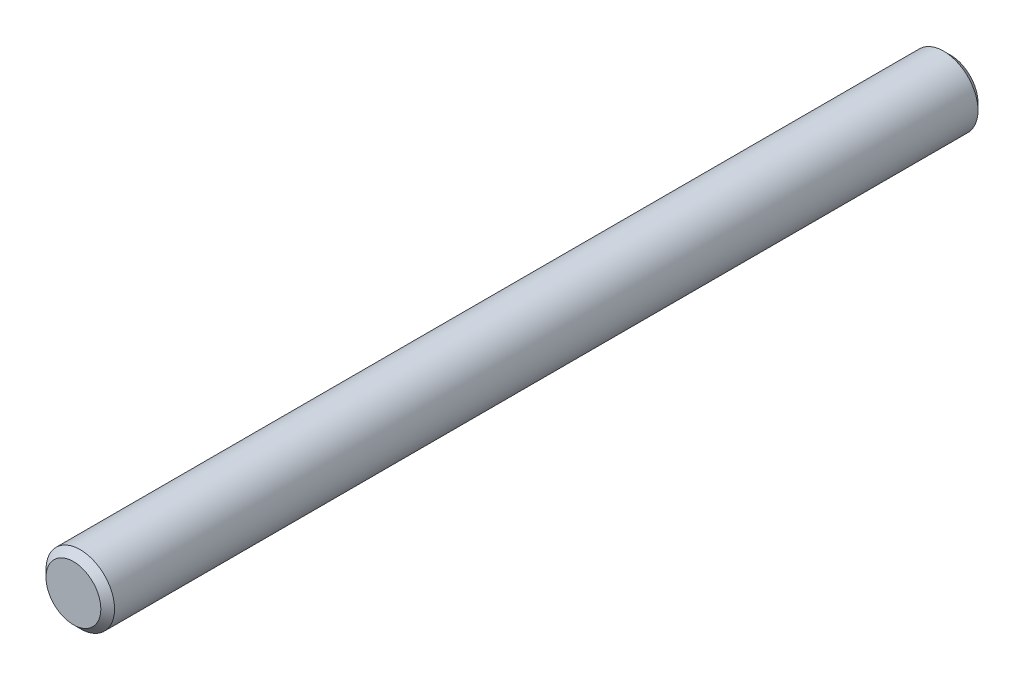
ISO-10303-21;
HEADER;
FILE_DESCRIPTION(('STEP AP214'),'2;1');
FILE_NAME('part.step','',(''),(''),'','','');
FILE_SCHEMA(('AUTOMOTIVE_DESIGN { 1 0 10303 214 1 1 1 1 }'));
ENDSEC;
DATA;
#1=APPLICATION_CONTEXT('core data for automotive mechanical design processes');
#2=APPLICATION_PROTOCOL_DEFINITION('international standard','automotive_design',2000,#1);
#3=PRODUCT_CONTEXT('',#1,'mechanical');
#4=PRODUCT('Part','Part','',(#3));
#5=PRODUCT_RELATED_PRODUCT_CATEGORY('part','',(#4));
#6=PRODUCT_DEFINITION_FORMATION('','',#4);
#7=PRODUCT_DEFINITION_CONTEXT('part definition',#1,'design');
#8=PRODUCT_DEFINITION('design','',#6,#7);
#9=PRODUCT_DEFINITION_SHAPE('','',#8);
#10=(LENGTH_UNIT() NAMED_UNIT(*) SI_UNIT(.MILLI.,.METRE.));
#11=(NAMED_UNIT(*) PLANE_ANGLE_UNIT() SI_UNIT($,.RADIAN.));
#12=(NAMED_UNIT(*) SI_UNIT($,.STERADIAN.) SOLID_ANGLE_UNIT());
#13=UNCERTAINTY_MEASURE_WITH_UNIT(LENGTH_MEASURE(1.E-05),#10,'distance_accuracy_value','');
#14=(GEOMETRIC_REPRESENTATION_CONTEXT(3) GLOBAL_UNCERTAINTY_ASSIGNED_CONTEXT((#13)) GLOBAL_UNIT_ASSIGNED_CONTEXT((#10,
#11,#12)) REPRESENTATION_CONTEXT('',''));
#15=CARTESIAN_POINT('',(0.,0.,0.));
#16=DIRECTION('',(0.,0.,1.));
#17=DIRECTION('',(1.,0.,0.));
#18=AXIS2_PLACEMENT_3D('',#15,#16,#17);
#19=CARTESIAN_POINT('',(0.,0.,101.6));
#20=DIRECTION('',(0.,0.,-1.));
#21=DIRECTION('',(-1.,0.,0.));
#22=AXIS2_PLACEMENT_3D('',#19,#20,#21);
#23=CYLINDRICAL_SURFACE('',#22,7.9375);
#24=CARTESIAN_POINT('',(0.,0.,-100.0125));
#25=DIRECTION('',(0.,0.,1.));
#26=DIRECTION('',(1.,0.,0.));
#27=AXIS2_PLACEMENT_3D('',#24,#25,#26);
#28=CIRCLE('',#27,7.9375);
#29=CARTESIAN_POINT('',(7.9375,0.,-100.0125));
#30=VERTEX_POINT('',#29);
#31=EDGE_CURVE('E50',#30,#30,#28,.T.);
#32=ORIENTED_EDGE('',*,*,#31,.T.);
#33=EDGE_LOOP('',(#32));
#34=FACE_BOUND('',#33,.T.);
#35=CARTESIAN_POINT('',(0.,0.,100.0125));
#36=DIRECTION('',(0.,0.,1.));
#37=DIRECTION('',(1.,0.,0.));
#38=AXIS2_PLACEMENT_3D('',#35,#36,#37);
#39=CIRCLE('',#38,7.9375);
#40=CARTESIAN_POINT('',(7.9375,0.,100.0125));
#41=VERTEX_POINT('',#40);
#42=EDGE_CURVE('E55',#41,#41,#39,.F.);
#43=ORIENTED_EDGE('',*,*,#42,.T.);
#44=EDGE_LOOP('',(#43));
#45=FACE_BOUND('',#44,.T.);
#46=ADVANCED_FACE('F37',(#34,#45),#23,.T.);
#47=CARTESIAN_POINT('',(0.,0.,101.6));
#48=DIRECTION('',(0.,0.,1.));
#49=DIRECTION('',(1.,0.,0.));
#50=AXIS2_PLACEMENT_3D('',#47,#48,#49);
#51=PLANE('',#50);
#52=CARTESIAN_POINT('',(0.,0.,101.6));
#53=DIRECTION('',(0.,0.,1.));
#54=DIRECTION('',(1.,0.,0.));
#55=AXIS2_PLACEMENT_3D('',#52,#53,#54);
#56=CIRCLE('',#55,6.34999999999997);
#57=CARTESIAN_POINT('',(6.34999999999997,0.,101.6));
#58=VERTEX_POINT('',#57);
#59=EDGE_CURVE('E10',#58,#58,#56,.T.);
#60=ORIENTED_EDGE('',*,*,#59,.T.);
#61=EDGE_LOOP('',(#60));
#62=FACE_BOUND('',#61,.T.);
#63=ADVANCED_FACE('F72',(#62),#51,.T.);
#64=CARTESIAN_POINT('',(0.,0.,-101.6));
#65=DIRECTION('',(0.,0.,1.));
#66=DIRECTION('',(1.,0.,0.));
#67=AXIS2_PLACEMENT_3D('',#64,#65,#66);
#68=PLANE('',#67);
#69=CARTESIAN_POINT('',(0.,0.,-101.6));
#70=DIRECTION('',(0.,0.,1.));
#71=DIRECTION('',(1.,0.,0.));
#72=AXIS2_PLACEMENT_3D('',#69,#70,#71);
#73=CIRCLE('',#72,6.35000000000002);
#74=CARTESIAN_POINT('',(6.35000000000002,0.,-101.6));
#75=VERTEX_POINT('',#74);
#76=EDGE_CURVE('E45',#75,#75,#73,.F.);
#77=ORIENTED_EDGE('',*,*,#76,.T.);
#78=EDGE_LOOP('',(#77));
#79=FACE_BOUND('',#78,.T.);
#80=ADVANCED_FACE('F69',(#79),#68,.F.);
#81=CARTESIAN_POINT('',(0.,0.,-100.0125));
#82=DIRECTION('',(0.,0.,1.));
#83=DIRECTION('',(1.,0.,0.));
#84=AXIS2_PLACEMENT_3D('',#81,#82,#83);
#85=CONICAL_SURFACE('',#84,7.9375,0.785398163397435);
#86=ORIENTED_EDGE('',*,*,#76,.F.);
#87=EDGE_LOOP('',(#86));
#88=FACE_BOUND('',#87,.T.);
#89=ORIENTED_EDGE('',*,*,#31,.F.);
#90=EDGE_LOOP('',(#89));
#91=FACE_BOUND('',#90,.T.);
#92=ADVANCED_FACE('F65',(#88,#91),#85,.T.);
#93=CARTESIAN_POINT('',(0.,0.,101.6));
#94=DIRECTION('',(0.,0.,-1.));
#95=DIRECTION('',(-1.,0.,0.));
#96=AXIS2_PLACEMENT_3D('',#93,#94,#95);
#97=CONICAL_SURFACE('',#96,6.34999999999997,0.78539816339744);
#98=ORIENTED_EDGE('',*,*,#42,.F.);
#99=EDGE_LOOP('',(#98));
#100=FACE_BOUND('',#99,.T.);
#101=ORIENTED_EDGE('',*,*,#59,.F.);
#102=EDGE_LOOP('',(#101));
#103=FACE_BOUND('',#102,.T.);
#104=ADVANCED_FACE('F39',(#100,#103),#97,.T.);
#105=CLOSED_SHELL('',(#46,#63,#80,#92,#104));
#106=MANIFOLD_SOLID_BREP('B2',#105);
#107=ADVANCED_BREP_SHAPE_REPRESENTATION('',(#18,#106),#14);
#108=SHAPE_DEFINITION_REPRESENTATION(#9,#107);
ENDSEC;
END-ISO-10303-21;
